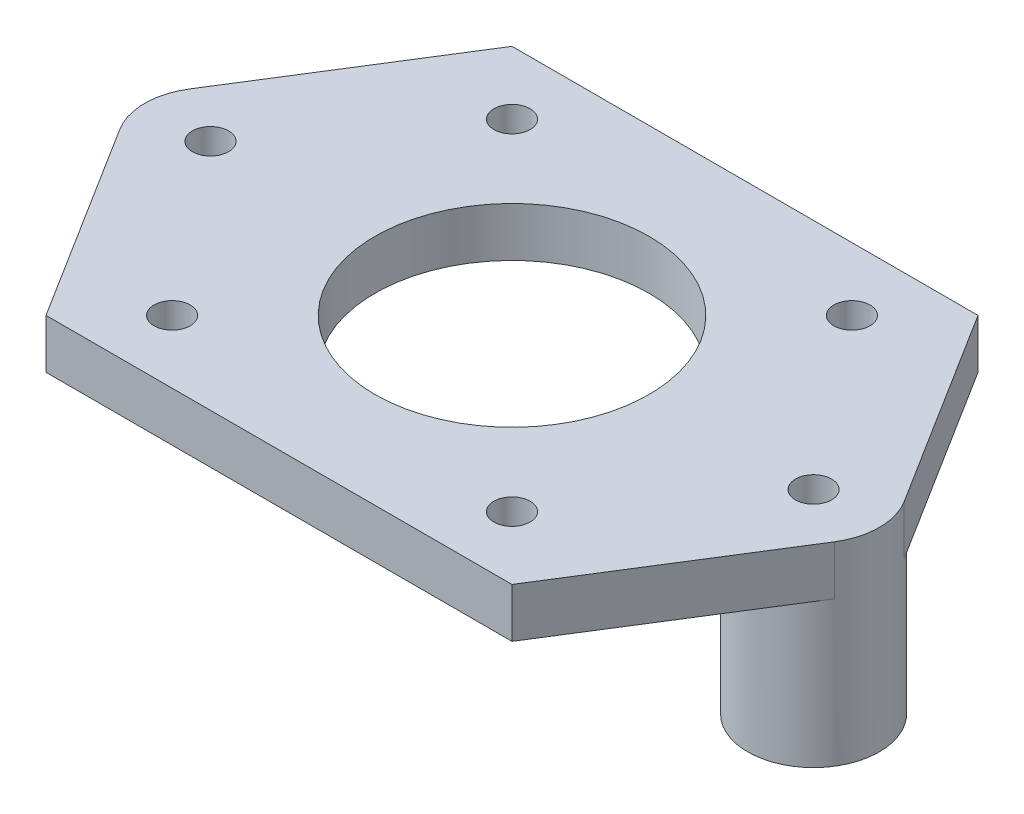
ISO-10303-21;
HEADER;
FILE_DESCRIPTION(('STEP AP214'),'2;1');
FILE_NAME('part.step','',(''),(''),'','','');
FILE_SCHEMA(('AUTOMOTIVE_DESIGN { 1 0 10303 214 1 1 1 1 }'));
ENDSEC;
DATA;
#1=APPLICATION_CONTEXT('core data for automotive mechanical design processes');
#2=APPLICATION_PROTOCOL_DEFINITION('international standard','automotive_design',2000,#1);
#3=PRODUCT_CONTEXT('',#1,'mechanical');
#4=PRODUCT('Part','Part','',(#3));
#5=PRODUCT_RELATED_PRODUCT_CATEGORY('part','',(#4));
#6=PRODUCT_DEFINITION_FORMATION('','',#4);
#7=PRODUCT_DEFINITION_CONTEXT('part definition',#1,'design');
#8=PRODUCT_DEFINITION('design','',#6,#7);
#9=PRODUCT_DEFINITION_SHAPE('','',#8);
#10=(LENGTH_UNIT() NAMED_UNIT(*) SI_UNIT(.MILLI.,.METRE.));
#11=(NAMED_UNIT(*) PLANE_ANGLE_UNIT() SI_UNIT($,.RADIAN.));
#12=(NAMED_UNIT(*) SI_UNIT($,.STERADIAN.) SOLID_ANGLE_UNIT());
#13=UNCERTAINTY_MEASURE_WITH_UNIT(LENGTH_MEASURE(1.E-05),#10,'distance_accuracy_value','');
#14=(GEOMETRIC_REPRESENTATION_CONTEXT(3) GLOBAL_UNCERTAINTY_ASSIGNED_CONTEXT((#13)) GLOBAL_UNIT_ASSIGNED_CONTEXT((#10,
#11,#12)) REPRESENTATION_CONTEXT('',''));
#15=CARTESIAN_POINT('',(0.,0.,0.));
#16=DIRECTION('',(0.,0.,1.));
#17=DIRECTION('',(1.,0.,0.));
#18=AXIS2_PLACEMENT_3D('',#15,#16,#17);
#19=CARTESIAN_POINT('',(24.8141545907209,143.73,15.5696073656687));
#20=DIRECTION('',(-0.847064789869419,0.,-0.53148964407924));
#21=DIRECTION('',(-0.53148964407924,0.,0.847064789869419));
#22=AXIS2_PLACEMENT_3D('',#19,#20,#21);
#23=PLANE('',#22);
#24=DIRECTION('',(0.53148964407924,0.,-0.847064789869419));
#25=VECTOR('',#24,1.);
#26=CARTESIAN_POINT('',(24.8141545907209,139.23,15.5696073656687));
#27=LINE('',#26,#25);
#28=CARTESIAN_POINT('',(21.25,139.23,21.25));
#29=VERTEX_POINT('',#28);
#30=CARTESIAN_POINT('',(32.5823887392165,139.23,3.18893786447545));
#31=VERTEX_POINT('',#30);
#32=EDGE_CURVE('E170',#29,#31,#27,.T.);
#33=ORIENTED_EDGE('',*,*,#32,.T.);
#34=DIRECTION('',(0.,-1.,0.));
#35=VECTOR('',#34,1.);
#36=CARTESIAN_POINT('',(32.5823887392165,143.73,3.18893786447545));
#37=LINE('',#36,#35);
#38=CARTESIAN_POINT('',(32.5823887392165,143.73,3.18893786447545));
#39=VERTEX_POINT('',#38);
#40=EDGE_CURVE('E223',#39,#31,#37,.T.);
#41=ORIENTED_EDGE('',*,*,#40,.F.);
#42=DIRECTION('',(0.53148964407924,0.,-0.847064789869419));
#43=VECTOR('',#42,1.);
#44=CARTESIAN_POINT('',(24.8141545907209,143.73,15.5696073656687));
#45=LINE('',#44,#43);
#46=CARTESIAN_POINT('',(21.25,143.73,21.25));
#47=VERTEX_POINT('',#46);
#48=EDGE_CURVE('E241',#47,#39,#45,.T.);
#49=ORIENTED_EDGE('',*,*,#48,.F.);
#50=DIRECTION('',(0.,-1.,0.));
#51=VECTOR('',#50,1.);
#52=CARTESIAN_POINT('',(21.25,143.73,21.25));
#53=LINE('',#52,#51);
#54=EDGE_CURVE('E165',#47,#29,#53,.T.);
#55=ORIENTED_EDGE('',*,*,#54,.T.);
#56=EDGE_LOOP('',(#33,#41,#49,#55));
#57=FACE_BOUND('',#56,.T.);
#58=ADVANCED_FACE('F41',(#57),#23,.F.);
#59=CARTESIAN_POINT('',(27.5,143.73,0.));
#60=DIRECTION('',(0.,-1.,0.));
#61=DIRECTION('',(0.,0.,-1.));
#62=AXIS2_PLACEMENT_3D('',#59,#60,#61);
#63=CYLINDRICAL_SURFACE('',#62,6.);
#64=ORIENTED_EDGE('',*,*,#40,.T.);
#65=CARTESIAN_POINT('',(27.5,139.23,0.));
#66=DIRECTION('',(0.,1.,0.));
#67=DIRECTION('',(0.,0.,1.));
#68=AXIS2_PLACEMENT_3D('',#65,#66,#67);
#69=CIRCLE('',#68,6.);
#70=CARTESIAN_POINT('',(32.5823887392165,139.23,-3.18893786447544));
#71=VERTEX_POINT('',#70);
#72=EDGE_CURVE('E11',#71,#31,#69,.T.);
#73=ORIENTED_EDGE('',*,*,#72,.F.);
#74=DIRECTION('',(0.,-1.,0.));
#75=VECTOR('',#74,1.);
#76=CARTESIAN_POINT('',(32.5823887392165,143.73,-3.18893786447545));
#77=LINE('',#76,#75);
#78=CARTESIAN_POINT('',(32.5823887392165,143.73,-3.18893786447545));
#79=VERTEX_POINT('',#78);
#80=EDGE_CURVE('E220',#79,#71,#77,.T.);
#81=ORIENTED_EDGE('',*,*,#80,.F.);
#82=CARTESIAN_POINT('',(27.5,143.73,0.));
#83=DIRECTION('',(0.,1.,0.));
#84=DIRECTION('',(0.,0.,1.));
#85=AXIS2_PLACEMENT_3D('',#82,#83,#84);
#86=CIRCLE('',#85,6.);
#87=EDGE_CURVE('E97',#39,#79,#86,.T.);
#88=ORIENTED_EDGE('',*,*,#87,.F.);
#89=EDGE_LOOP('',(#64,#73,#81,#88));
#90=FACE_BOUND('',#89,.T.);
#91=CARTESIAN_POINT('',(27.5,126.,0.));
#92=DIRECTION('',(0.,-1.,0.));
#93=DIRECTION('',(0.,0.,-1.));
#94=AXIS2_PLACEMENT_3D('',#91,#92,#93);
#95=CIRCLE('',#94,6.);
#96=CARTESIAN_POINT('',(27.5,126.,-6.));
#97=VERTEX_POINT('',#96);
#98=EDGE_CURVE('E354',#97,#97,#95,.F.);
#99=ORIENTED_EDGE('',*,*,#98,.T.);
#100=EDGE_LOOP('',(#99));
#101=FACE_BOUND('',#100,.T.);
#102=ADVANCED_FACE('F267',(#90,#101),#63,.T.);
#103=CARTESIAN_POINT('',(24.8141545907209,143.73,-15.5696073656687));
#104=DIRECTION('',(0.847064789869419,0.,-0.53148964407924));
#105=DIRECTION('',(-0.53148964407924,0.,-0.847064789869419));
#106=AXIS2_PLACEMENT_3D('',#103,#104,#105);
#107=PLANE('',#106);
#108=DIRECTION('',(0.53148964407924,0.,0.847064789869419));
#109=VECTOR('',#108,1.);
#110=CARTESIAN_POINT('',(24.8141545907209,139.23,-15.5696073656687));
#111=LINE('',#110,#109);
#112=CARTESIAN_POINT('',(21.25,139.23,-21.25));
#113=VERTEX_POINT('',#112);
#114=EDGE_CURVE('E175',#113,#71,#111,.T.);
#115=ORIENTED_EDGE('',*,*,#114,.F.);
#116=DIRECTION('',(0.,-1.,0.));
#117=VECTOR('',#116,1.);
#118=CARTESIAN_POINT('',(21.25,143.73,-21.25));
#119=LINE('',#118,#117);
#120=CARTESIAN_POINT('',(21.25,143.73,-21.25));
#121=VERTEX_POINT('',#120);
#122=EDGE_CURVE('E217',#121,#113,#119,.T.);
#123=ORIENTED_EDGE('',*,*,#122,.F.);
#124=DIRECTION('',(0.53148964407924,0.,0.847064789869419));
#125=VECTOR('',#124,1.);
#126=CARTESIAN_POINT('',(24.8141545907209,143.73,-15.5696073656687));
#127=LINE('',#126,#125);
#128=EDGE_CURVE('E246',#121,#79,#127,.T.);
#129=ORIENTED_EDGE('',*,*,#128,.T.);
#130=ORIENTED_EDGE('',*,*,#80,.T.);
#131=EDGE_LOOP('',(#115,#123,#129,#130));
#132=FACE_BOUND('',#131,.T.);
#133=ADVANCED_FACE('F266',(#132),#107,.T.);
#134=CARTESIAN_POINT('',(0.,143.73,-21.25));
#135=DIRECTION('',(0.,0.,-1.));
#136=DIRECTION('',(-1.,0.,0.));
#137=AXIS2_PLACEMENT_3D('',#134,#135,#136);
#138=PLANE('',#137);
#139=DIRECTION('',(1.,0.,0.));
#140=VECTOR('',#139,1.);
#141=CARTESIAN_POINT('',(0.,139.23,-21.25));
#142=LINE('',#141,#140);
#143=CARTESIAN_POINT('',(-21.25,139.23,-21.25));
#144=VERTEX_POINT('',#143);
#145=EDGE_CURVE('E179',#144,#113,#142,.T.);
#146=ORIENTED_EDGE('',*,*,#145,.F.);
#147=DIRECTION('',(0.,-1.,0.));
#148=VECTOR('',#147,1.);
#149=CARTESIAN_POINT('',(-21.25,143.73,-21.25));
#150=LINE('',#149,#148);
#151=CARTESIAN_POINT('',(-21.25,143.73,-21.25));
#152=VERTEX_POINT('',#151);
#153=EDGE_CURVE('E214',#152,#144,#150,.T.);
#154=ORIENTED_EDGE('',*,*,#153,.F.);
#155=DIRECTION('',(1.,0.,0.));
#156=VECTOR('',#155,1.);
#157=CARTESIAN_POINT('',(0.,143.73,-21.25));
#158=LINE('',#157,#156);
#159=EDGE_CURVE('E250',#152,#121,#158,.T.);
#160=ORIENTED_EDGE('',*,*,#159,.T.);
#161=ORIENTED_EDGE('',*,*,#122,.T.);
#162=EDGE_LOOP('',(#146,#154,#160,#161));
#163=FACE_BOUND('',#162,.T.);
#164=ADVANCED_FACE('F263',(#163),#138,.T.);
#165=CARTESIAN_POINT('',(-24.8141545907209,143.73,-15.5696073656687));
#166=DIRECTION('',(-0.847064789869419,0.,-0.53148964407924));
#167=DIRECTION('',(-0.53148964407924,0.,0.847064789869419));
#168=AXIS2_PLACEMENT_3D('',#165,#166,#167);
#169=PLANE('',#168);
#170=DIRECTION('',(0.53148964407924,0.,-0.847064789869419));
#171=VECTOR('',#170,1.);
#172=CARTESIAN_POINT('',(-24.8141545907209,139.23,-15.5696073656687));
#173=LINE('',#172,#171);
#174=CARTESIAN_POINT('',(-32.5823887392165,139.23,-3.18893786447544));
#175=VERTEX_POINT('',#174);
#176=EDGE_CURVE('E183',#175,#144,#173,.T.);
#177=ORIENTED_EDGE('',*,*,#176,.F.);
#178=DIRECTION('',(0.,-1.,0.));
#179=VECTOR('',#178,1.);
#180=CARTESIAN_POINT('',(-32.5823887392165,143.73,-3.18893786447544));
#181=LINE('',#180,#179);
#182=CARTESIAN_POINT('',(-32.5823887392165,143.73,-3.18893786447544));
#183=VERTEX_POINT('',#182);
#184=EDGE_CURVE('E131',#183,#175,#181,.T.);
#185=ORIENTED_EDGE('',*,*,#184,.F.);
#186=DIRECTION('',(0.53148964407924,0.,-0.847064789869419));
#187=VECTOR('',#186,1.);
#188=CARTESIAN_POINT('',(-24.8141545907209,143.73,-15.5696073656687));
#189=LINE('',#188,#187);
#190=EDGE_CURVE('E121',#183,#152,#189,.T.);
#191=ORIENTED_EDGE('',*,*,#190,.T.);
#192=ORIENTED_EDGE('',*,*,#153,.T.);
#193=EDGE_LOOP('',(#177,#185,#191,#192));
#194=FACE_BOUND('',#193,.T.);
#195=ADVANCED_FACE('F256',(#194),#169,.T.);
#196=CARTESIAN_POINT('',(-27.5,143.73,0.));
#197=DIRECTION('',(0.,-1.,0.));
#198=DIRECTION('',(0.,0.,-1.));
#199=AXIS2_PLACEMENT_3D('',#196,#197,#198);
#200=CYLINDRICAL_SURFACE('',#199,6.);
#201=ORIENTED_EDGE('',*,*,#184,.T.);
#202=CARTESIAN_POINT('',(-27.5,139.23,0.));
#203=DIRECTION('',(0.,1.,0.));
#204=DIRECTION('',(0.,0.,1.));
#205=AXIS2_PLACEMENT_3D('',#202,#203,#204);
#206=CIRCLE('',#205,6.);
#207=CARTESIAN_POINT('',(-32.5823887392165,139.23,3.18893786447544));
#208=VERTEX_POINT('',#207);
#209=EDGE_CURVE('E51',#208,#175,#206,.T.);
#210=ORIENTED_EDGE('',*,*,#209,.F.);
#211=DIRECTION('',(0.,-1.,0.));
#212=VECTOR('',#211,1.);
#213=CARTESIAN_POINT('',(-32.5823887392165,143.73,3.18893786447544));
#214=LINE('',#213,#212);
#215=CARTESIAN_POINT('',(-32.5823887392165,143.73,3.18893786447544));
#216=VERTEX_POINT('',#215);
#217=EDGE_CURVE('E127',#216,#208,#214,.T.);
#218=ORIENTED_EDGE('',*,*,#217,.F.);
#219=CARTESIAN_POINT('',(-27.5,143.73,0.));
#220=DIRECTION('',(0.,1.,0.));
#221=DIRECTION('',(0.,0.,1.));
#222=AXIS2_PLACEMENT_3D('',#219,#220,#221);
#223=CIRCLE('',#222,6.);
#224=EDGE_CURVE('E113',#183,#216,#223,.T.);
#225=ORIENTED_EDGE('',*,*,#224,.F.);
#226=EDGE_LOOP('',(#201,#210,#218,#225));
#227=FACE_BOUND('',#226,.T.);
#228=CARTESIAN_POINT('',(-27.5,126.,0.));
#229=DIRECTION('',(0.,-1.,0.));
#230=DIRECTION('',(0.,0.,-1.));
#231=AXIS2_PLACEMENT_3D('',#228,#229,#230);
#232=CIRCLE('',#231,6.);
#233=CARTESIAN_POINT('',(-27.5,126.,-6.));
#234=VERTEX_POINT('',#233);
#235=EDGE_CURVE('E233',#234,#234,#232,.F.);
#236=ORIENTED_EDGE('',*,*,#235,.T.);
#237=EDGE_LOOP('',(#236));
#238=FACE_BOUND('',#237,.T.);
#239=ADVANCED_FACE('F128',(#227,#238),#200,.T.);
#240=CARTESIAN_POINT('',(-24.8141545907209,143.73,15.5696073656687));
#241=DIRECTION('',(0.847064789869419,0.,-0.53148964407924));
#242=DIRECTION('',(-0.53148964407924,0.,-0.847064789869419));
#243=AXIS2_PLACEMENT_3D('',#240,#241,#242);
#244=PLANE('',#243);
#245=DIRECTION('',(0.53148964407924,0.,0.847064789869419));
#246=VECTOR('',#245,1.);
#247=CARTESIAN_POINT('',(-24.8141545907209,139.23,15.5696073656687));
#248=LINE('',#247,#246);
#249=CARTESIAN_POINT('',(-21.25,139.23,21.25));
#250=VERTEX_POINT('',#249);
#251=EDGE_CURVE('E82',#208,#250,#248,.T.);
#252=ORIENTED_EDGE('',*,*,#251,.T.);
#253=DIRECTION('',(0.,-1.,0.));
#254=VECTOR('',#253,1.);
#255=CARTESIAN_POINT('',(-21.25,143.73,21.25));
#256=LINE('',#255,#254);
#257=CARTESIAN_POINT('',(-21.25,143.73,21.25));
#258=VERTEX_POINT('',#257);
#259=EDGE_CURVE('E132',#258,#250,#256,.T.);
#260=ORIENTED_EDGE('',*,*,#259,.F.);
#261=DIRECTION('',(0.53148964407924,0.,0.847064789869419));
#262=VECTOR('',#261,1.);
#263=CARTESIAN_POINT('',(-24.8141545907209,143.73,15.5696073656687));
#264=LINE('',#263,#262);
#265=EDGE_CURVE('E118',#216,#258,#264,.T.);
#266=ORIENTED_EDGE('',*,*,#265,.F.);
#267=ORIENTED_EDGE('',*,*,#217,.T.);
#268=EDGE_LOOP('',(#252,#260,#266,#267));
#269=FACE_BOUND('',#268,.T.);
#270=ADVANCED_FACE('F134',(#269),#244,.F.);
#271=CARTESIAN_POINT('',(-27.5,143.73,0.));
#272=DIRECTION('',(0.,-1.,0.));
#273=DIRECTION('',(0.,0.,-1.));
#274=AXIS2_PLACEMENT_3D('',#271,#272,#273);
#275=CYLINDRICAL_SURFACE('',#274,1.65);
#276=CARTESIAN_POINT('',(-27.5,143.73,0.));
#277=DIRECTION('',(0.,1.,0.));
#278=DIRECTION('',(0.,0.,1.));
#279=AXIS2_PLACEMENT_3D('',#276,#277,#278);
#280=CIRCLE('',#279,1.65);
#281=CARTESIAN_POINT('',(-27.5,143.73,1.65));
#282=VERTEX_POINT('',#281);
#283=EDGE_CURVE('E157',#282,#282,#280,.T.);
#284=ORIENTED_EDGE('',*,*,#283,.T.);
#285=EDGE_LOOP('',(#284));
#286=FACE_BOUND('',#285,.T.);
#287=CARTESIAN_POINT('',(-27.5,126.,0.));
#288=DIRECTION('',(0.,-1.,0.));
#289=DIRECTION('',(0.,0.,-1.));
#290=AXIS2_PLACEMENT_3D('',#287,#288,#289);
#291=CIRCLE('',#290,1.65);
#292=CARTESIAN_POINT('',(-27.5,126.,-1.65));
#293=VERTEX_POINT('',#292);
#294=EDGE_CURVE('E171',#293,#293,#291,.F.);
#295=ORIENTED_EDGE('',*,*,#294,.F.);
#296=EDGE_LOOP('',(#295));
#297=FACE_BOUND('',#296,.T.);
#298=ADVANCED_FACE('F300',(#286,#297),#275,.F.);
#299=CARTESIAN_POINT('',(-15.5,143.73,-15.5));
#300=DIRECTION('',(0.,-1.,0.));
#301=DIRECTION('',(0.,0.,-1.));
#302=AXIS2_PLACEMENT_3D('',#299,#300,#301);
#303=CYLINDRICAL_SURFACE('',#302,1.65);
#304=CARTESIAN_POINT('',(-15.5,143.73,-15.5));
#305=DIRECTION('',(0.,1.,0.));
#306=DIRECTION('',(0.,0.,1.));
#307=AXIS2_PLACEMENT_3D('',#304,#305,#306);
#308=CIRCLE('',#307,1.65);
#309=CARTESIAN_POINT('',(-15.5,143.73,-13.85));
#310=VERTEX_POINT('',#309);
#311=EDGE_CURVE('E153',#310,#310,#308,.T.);
#312=ORIENTED_EDGE('',*,*,#311,.T.);
#313=EDGE_LOOP('',(#312));
#314=FACE_BOUND('',#313,.T.);
#315=CARTESIAN_POINT('',(-15.5,139.23,-15.5));
#316=DIRECTION('',(0.,1.,0.));
#317=DIRECTION('',(0.,0.,1.));
#318=AXIS2_PLACEMENT_3D('',#315,#316,#317);
#319=CIRCLE('',#318,1.65);
#320=CARTESIAN_POINT('',(-15.5,139.23,-13.85));
#321=VERTEX_POINT('',#320);
#322=EDGE_CURVE('E203',#321,#321,#319,.T.);
#323=ORIENTED_EDGE('',*,*,#322,.F.);
#324=EDGE_LOOP('',(#323));
#325=FACE_BOUND('',#324,.T.);
#326=ADVANCED_FACE('F304',(#314,#325),#303,.F.);
#327=CARTESIAN_POINT('',(15.5,143.73,-15.5));
#328=DIRECTION('',(0.,-1.,0.));
#329=DIRECTION('',(0.,0.,-1.));
#330=AXIS2_PLACEMENT_3D('',#327,#328,#329);
#331=CYLINDRICAL_SURFACE('',#330,1.65);
#332=CARTESIAN_POINT('',(15.5,143.73,-15.5));
#333=DIRECTION('',(0.,1.,0.));
#334=DIRECTION('',(0.,0.,1.));
#335=AXIS2_PLACEMENT_3D('',#332,#333,#334);
#336=CIRCLE('',#335,1.65);
#337=CARTESIAN_POINT('',(15.5,143.73,-13.85));
#338=VERTEX_POINT('',#337);
#339=EDGE_CURVE('E149',#338,#338,#336,.T.);
#340=ORIENTED_EDGE('',*,*,#339,.T.);
#341=EDGE_LOOP('',(#340));
#342=FACE_BOUND('',#341,.T.);
#343=CARTESIAN_POINT('',(15.5,139.23,-15.5));
#344=DIRECTION('',(0.,1.,0.));
#345=DIRECTION('',(0.,0.,1.));
#346=AXIS2_PLACEMENT_3D('',#343,#344,#345);
#347=CIRCLE('',#346,1.65);
#348=CARTESIAN_POINT('',(15.5,139.23,-13.85));
#349=VERTEX_POINT('',#348);
#350=EDGE_CURVE('E199',#349,#349,#347,.T.);
#351=ORIENTED_EDGE('',*,*,#350,.F.);
#352=EDGE_LOOP('',(#351));
#353=FACE_BOUND('',#352,.T.);
#354=ADVANCED_FACE('F310',(#342,#353),#331,.F.);
#355=CARTESIAN_POINT('',(15.5,143.73,15.5));
#356=DIRECTION('',(0.,-1.,0.));
#357=DIRECTION('',(0.,0.,-1.));
#358=AXIS2_PLACEMENT_3D('',#355,#356,#357);
#359=CYLINDRICAL_SURFACE('',#358,1.65);
#360=CARTESIAN_POINT('',(15.5,143.73,15.5));
#361=DIRECTION('',(0.,1.,0.));
#362=DIRECTION('',(0.,0.,1.));
#363=AXIS2_PLACEMENT_3D('',#360,#361,#362);
#364=CIRCLE('',#363,1.65);
#365=CARTESIAN_POINT('',(15.5,143.73,17.15));
#366=VERTEX_POINT('',#365);
#367=EDGE_CURVE('E145',#366,#366,#364,.T.);
#368=ORIENTED_EDGE('',*,*,#367,.T.);
#369=EDGE_LOOP('',(#368));
#370=FACE_BOUND('',#369,.T.);
#371=CARTESIAN_POINT('',(15.5,139.23,15.5));
#372=DIRECTION('',(0.,1.,0.));
#373=DIRECTION('',(0.,0.,1.));
#374=AXIS2_PLACEMENT_3D('',#371,#372,#373);
#375=CIRCLE('',#374,1.65);
#376=CARTESIAN_POINT('',(15.5,139.23,17.15));
#377=VERTEX_POINT('',#376);
#378=EDGE_CURVE('E195',#377,#377,#375,.T.);
#379=ORIENTED_EDGE('',*,*,#378,.F.);
#380=EDGE_LOOP('',(#379));
#381=FACE_BOUND('',#380,.T.);
#382=ADVANCED_FACE('F282',(#370,#381),#359,.F.);
#383=CARTESIAN_POINT('',(-15.5,143.73,15.5));
#384=DIRECTION('',(0.,-1.,0.));
#385=DIRECTION('',(0.,0.,-1.));
#386=AXIS2_PLACEMENT_3D('',#383,#384,#385);
#387=CYLINDRICAL_SURFACE('',#386,1.65);
#388=CARTESIAN_POINT('',(-15.5,143.73,15.5));
#389=DIRECTION('',(0.,1.,0.));
#390=DIRECTION('',(0.,0.,1.));
#391=AXIS2_PLACEMENT_3D('',#388,#389,#390);
#392=CIRCLE('',#391,1.65);
#393=CARTESIAN_POINT('',(-15.5,143.73,17.15));
#394=VERTEX_POINT('',#393);
#395=EDGE_CURVE('E138',#394,#394,#392,.T.);
#396=ORIENTED_EDGE('',*,*,#395,.T.);
#397=EDGE_LOOP('',(#396));
#398=FACE_BOUND('',#397,.T.);
#399=CARTESIAN_POINT('',(-15.5,139.23,15.5));
#400=DIRECTION('',(0.,1.,0.));
#401=DIRECTION('',(0.,0.,1.));
#402=AXIS2_PLACEMENT_3D('',#399,#400,#401);
#403=CIRCLE('',#402,1.65);
#404=CARTESIAN_POINT('',(-15.5,139.23,17.15));
#405=VERTEX_POINT('',#404);
#406=EDGE_CURVE('E191',#405,#405,#403,.T.);
#407=ORIENTED_EDGE('',*,*,#406,.F.);
#408=EDGE_LOOP('',(#407));
#409=FACE_BOUND('',#408,.T.);
#410=ADVANCED_FACE('F274',(#398,#409),#387,.F.);
#411=CARTESIAN_POINT('',(0.,143.73,21.25));
#412=DIRECTION('',(0.,0.,-1.));
#413=DIRECTION('',(-1.,0.,0.));
#414=AXIS2_PLACEMENT_3D('',#411,#412,#413);
#415=PLANE('',#414);
#416=DIRECTION('',(1.,0.,0.));
#417=VECTOR('',#416,1.);
#418=CARTESIAN_POINT('',(0.,139.23,21.25));
#419=LINE('',#418,#417);
#420=EDGE_CURVE('E88',#250,#29,#419,.T.);
#421=ORIENTED_EDGE('',*,*,#420,.T.);
#422=ORIENTED_EDGE('',*,*,#54,.F.);
#423=DIRECTION('',(1.,0.,0.));
#424=VECTOR('',#423,1.);
#425=CARTESIAN_POINT('',(0.,143.73,21.25));
#426=LINE('',#425,#424);
#427=EDGE_CURVE('E59',#258,#47,#426,.T.);
#428=ORIENTED_EDGE('',*,*,#427,.F.);
#429=ORIENTED_EDGE('',*,*,#259,.T.);
#430=EDGE_LOOP('',(#421,#422,#428,#429));
#431=FACE_BOUND('',#430,.T.);
#432=ADVANCED_FACE('F272',(#431),#415,.F.);
#433=CARTESIAN_POINT('',(0.,143.73,0.));
#434=DIRECTION('',(0.,-1.,0.));
#435=DIRECTION('',(0.,0.,-1.));
#436=AXIS2_PLACEMENT_3D('',#433,#434,#435);
#437=CYLINDRICAL_SURFACE('',#436,12.5);
#438=CARTESIAN_POINT('',(0.,143.73,0.));
#439=DIRECTION('',(0.,1.,0.));
#440=DIRECTION('',(0.,0.,1.));
#441=AXIS2_PLACEMENT_3D('',#438,#439,#440);
#442=CIRCLE('',#441,12.5);
#443=CARTESIAN_POINT('',(0.,143.73,12.5));
#444=VERTEX_POINT('',#443);
#445=EDGE_CURVE('E207',#444,#444,#442,.T.);
#446=ORIENTED_EDGE('',*,*,#445,.T.);
#447=EDGE_LOOP('',(#446));
#448=FACE_BOUND('',#447,.T.);
#449=CARTESIAN_POINT('',(0.,139.23,0.));
#450=DIRECTION('',(0.,1.,0.));
#451=DIRECTION('',(0.,0.,1.));
#452=AXIS2_PLACEMENT_3D('',#449,#450,#451);
#453=CIRCLE('',#452,12.5);
#454=CARTESIAN_POINT('',(0.,139.23,12.5));
#455=VERTEX_POINT('',#454);
#456=EDGE_CURVE('E166',#455,#455,#453,.T.);
#457=ORIENTED_EDGE('',*,*,#456,.F.);
#458=EDGE_LOOP('',(#457));
#459=FACE_BOUND('',#458,.T.);
#460=ADVANCED_FACE('F43',(#448,#459),#437,.F.);
#461=CARTESIAN_POINT('',(27.5,143.73,0.));
#462=DIRECTION('',(0.,-1.,0.));
#463=DIRECTION('',(0.,0.,-1.));
#464=AXIS2_PLACEMENT_3D('',#461,#462,#463);
#465=CYLINDRICAL_SURFACE('',#464,1.65);
#466=CARTESIAN_POINT('',(27.5,143.73,0.));
#467=DIRECTION('',(0.,1.,0.));
#468=DIRECTION('',(0.,0.,1.));
#469=AXIS2_PLACEMENT_3D('',#466,#467,#468);
#470=CIRCLE('',#469,1.65);
#471=CARTESIAN_POINT('',(27.5,143.73,1.65));
#472=VERTEX_POINT('',#471);
#473=EDGE_CURVE('E161',#472,#472,#470,.T.);
#474=ORIENTED_EDGE('',*,*,#473,.T.);
#475=EDGE_LOOP('',(#474));
#476=FACE_BOUND('',#475,.T.);
#477=CARTESIAN_POINT('',(27.5,126.,0.));
#478=DIRECTION('',(0.,-1.,0.));
#479=DIRECTION('',(0.,0.,-1.));
#480=AXIS2_PLACEMENT_3D('',#477,#478,#479);
#481=CIRCLE('',#480,1.65);
#482=CARTESIAN_POINT('',(27.5,126.,-1.65));
#483=VERTEX_POINT('',#482);
#484=EDGE_CURVE('E237',#483,#483,#481,.F.);
#485=ORIENTED_EDGE('',*,*,#484,.F.);
#486=EDGE_LOOP('',(#485));
#487=FACE_BOUND('',#486,.T.);
#488=ADVANCED_FACE('F280',(#476,#487),#465,.F.);
#489=CARTESIAN_POINT('',(0.,143.73,0.));
#490=DIRECTION('',(0.,1.,0.));
#491=DIRECTION('',(0.,0.,1.));
#492=AXIS2_PLACEMENT_3D('',#489,#490,#491);
#493=PLANE('',#492);
#494=ORIENTED_EDGE('',*,*,#445,.F.);
#495=EDGE_LOOP('',(#494));
#496=FACE_BOUND('',#495,.T.);
#497=ORIENTED_EDGE('',*,*,#48,.T.);
#498=ORIENTED_EDGE('',*,*,#87,.T.);
#499=ORIENTED_EDGE('',*,*,#128,.F.);
#500=ORIENTED_EDGE('',*,*,#159,.F.);
#501=ORIENTED_EDGE('',*,*,#190,.F.);
#502=ORIENTED_EDGE('',*,*,#224,.T.);
#503=ORIENTED_EDGE('',*,*,#265,.T.);
#504=ORIENTED_EDGE('',*,*,#427,.T.);
#505=EDGE_LOOP('',(#497,#498,#499,#500,#501,#502,#503,#504));
#506=FACE_BOUND('',#505,.T.);
#507=ORIENTED_EDGE('',*,*,#395,.F.);
#508=EDGE_LOOP('',(#507));
#509=FACE_BOUND('',#508,.T.);
#510=ORIENTED_EDGE('',*,*,#367,.F.);
#511=EDGE_LOOP('',(#510));
#512=FACE_BOUND('',#511,.T.);
#513=ORIENTED_EDGE('',*,*,#339,.F.);
#514=EDGE_LOOP('',(#513));
#515=FACE_BOUND('',#514,.T.);
#516=ORIENTED_EDGE('',*,*,#311,.F.);
#517=EDGE_LOOP('',(#516));
#518=FACE_BOUND('',#517,.T.);
#519=ORIENTED_EDGE('',*,*,#283,.F.);
#520=EDGE_LOOP('',(#519));
#521=FACE_BOUND('',#520,.T.);
#522=ORIENTED_EDGE('',*,*,#473,.F.);
#523=EDGE_LOOP('',(#522));
#524=FACE_BOUND('',#523,.T.);
#525=ADVANCED_FACE('F115',(#496,#506,#509,#512,#515,#518,#521,#524),#493,.T.);
#526=CARTESIAN_POINT('',(0.,139.23,0.));
#527=DIRECTION('',(0.,1.,0.));
#528=DIRECTION('',(0.,0.,1.));
#529=AXIS2_PLACEMENT_3D('',#526,#527,#528);
#530=PLANE('',#529);
#531=ORIENTED_EDGE('',*,*,#456,.T.);
#532=EDGE_LOOP('',(#531));
#533=FACE_BOUND('',#532,.T.);
#534=ORIENTED_EDGE('',*,*,#114,.T.);
#535=ORIENTED_EDGE('',*,*,#72,.T.);
#536=ORIENTED_EDGE('',*,*,#32,.F.);
#537=ORIENTED_EDGE('',*,*,#420,.F.);
#538=ORIENTED_EDGE('',*,*,#251,.F.);
#539=ORIENTED_EDGE('',*,*,#209,.T.);
#540=ORIENTED_EDGE('',*,*,#176,.T.);
#541=ORIENTED_EDGE('',*,*,#145,.T.);
#542=EDGE_LOOP('',(#534,#535,#536,#537,#538,#539,#540,#541));
#543=FACE_BOUND('',#542,.T.);
#544=ORIENTED_EDGE('',*,*,#406,.T.);
#545=EDGE_LOOP('',(#544));
#546=FACE_BOUND('',#545,.T.);
#547=ORIENTED_EDGE('',*,*,#378,.T.);
#548=EDGE_LOOP('',(#547));
#549=FACE_BOUND('',#548,.T.);
#550=ORIENTED_EDGE('',*,*,#350,.T.);
#551=EDGE_LOOP('',(#550));
#552=FACE_BOUND('',#551,.T.);
#553=ORIENTED_EDGE('',*,*,#322,.T.);
#554=EDGE_LOOP('',(#553));
#555=FACE_BOUND('',#554,.T.);
#556=ADVANCED_FACE('F258',(#533,#543,#546,#549,#552,#555),#530,.F.);
#557=CARTESIAN_POINT('',(0.,126.,0.));
#558=DIRECTION('',(0.,-1.,0.));
#559=DIRECTION('',(0.,0.,-1.));
#560=AXIS2_PLACEMENT_3D('',#557,#558,#559);
#561=PLANE('',#560);
#562=ORIENTED_EDGE('',*,*,#235,.F.);
#563=EDGE_LOOP('',(#562));
#564=FACE_BOUND('',#563,.T.);
#565=ORIENTED_EDGE('',*,*,#294,.T.);
#566=EDGE_LOOP('',(#565));
#567=FACE_BOUND('',#566,.T.);
#568=ADVANCED_FACE('F330',(#564,#567),#561,.T.);
#569=CARTESIAN_POINT('',(0.,126.,0.));
#570=DIRECTION('',(0.,-1.,0.));
#571=DIRECTION('',(0.,0.,-1.));
#572=AXIS2_PLACEMENT_3D('',#569,#570,#571);
#573=PLANE('',#572);
#574=ORIENTED_EDGE('',*,*,#98,.F.);
#575=EDGE_LOOP('',(#574));
#576=FACE_BOUND('',#575,.T.);
#577=ORIENTED_EDGE('',*,*,#484,.T.);
#578=EDGE_LOOP('',(#577));
#579=FACE_BOUND('',#578,.T.);
#580=ADVANCED_FACE('F341',(#576,#579),#573,.T.);
#581=CLOSED_SHELL('',(#58,#102,#133,#164,#195,#239,#270,#298,#326,#354,#382,#410,#432,#460,#488,
#525,#556,#568,#580));
#582=MANIFOLD_SOLID_BREP('B2',#581);
#583=ADVANCED_BREP_SHAPE_REPRESENTATION('',(#18,#582),#14);
#584=SHAPE_DEFINITION_REPRESENTATION(#9,#583);
ENDSEC;
END-ISO-10303-21;
